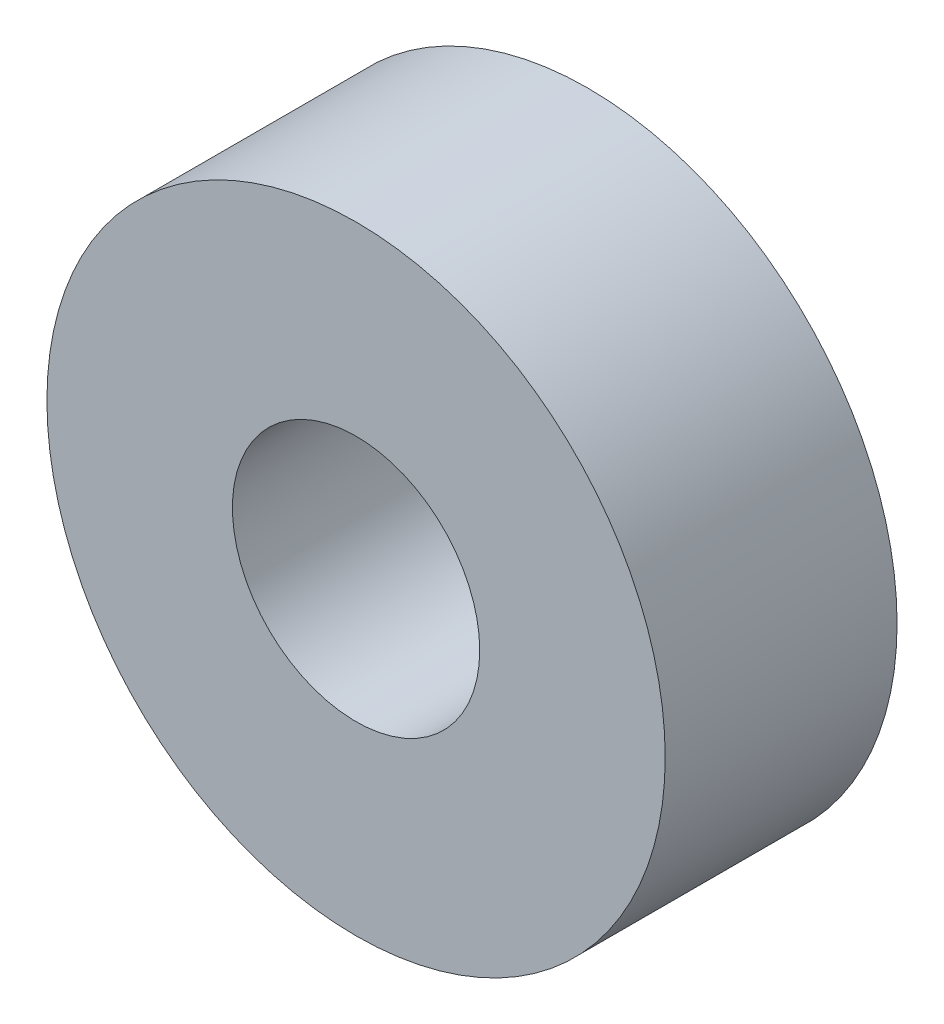
ISO-10303-21;
HEADER;
FILE_DESCRIPTION(('STEP AP214'),'2;1');
FILE_NAME('part.step','',(''),(''),'','','');
FILE_SCHEMA(('AUTOMOTIVE_DESIGN { 1 0 10303 214 1 1 1 1 }'));
ENDSEC;
DATA;
#1=APPLICATION_CONTEXT('core data for automotive mechanical design processes');
#2=APPLICATION_PROTOCOL_DEFINITION('international standard','automotive_design',2000,#1);
#3=PRODUCT_CONTEXT('',#1,'mechanical');
#4=PRODUCT('Part','Part','',(#3));
#5=PRODUCT_RELATED_PRODUCT_CATEGORY('part','',(#4));
#6=PRODUCT_DEFINITION_FORMATION('','',#4);
#7=PRODUCT_DEFINITION_CONTEXT('part definition',#1,'design');
#8=PRODUCT_DEFINITION('design','',#6,#7);
#9=PRODUCT_DEFINITION_SHAPE('','',#8);
#10=(LENGTH_UNIT() NAMED_UNIT(*) SI_UNIT(.MILLI.,.METRE.));
#11=(NAMED_UNIT(*) PLANE_ANGLE_UNIT() SI_UNIT($,.RADIAN.));
#12=(NAMED_UNIT(*) SI_UNIT($,.STERADIAN.) SOLID_ANGLE_UNIT());
#13=UNCERTAINTY_MEASURE_WITH_UNIT(LENGTH_MEASURE(1.E-05),#10,'distance_accuracy_value','');
#14=(GEOMETRIC_REPRESENTATION_CONTEXT(3) GLOBAL_UNCERTAINTY_ASSIGNED_CONTEXT((#13)) GLOBAL_UNIT_ASSIGNED_CONTEXT((#10,
#11,#12)) REPRESENTATION_CONTEXT('',''));
#15=CARTESIAN_POINT('',(0.,0.,0.));
#16=DIRECTION('',(0.,0.,1.));
#17=DIRECTION('',(1.,0.,0.));
#18=AXIS2_PLACEMENT_3D('',#15,#16,#17);
#19=CARTESIAN_POINT('',(0.,0.,1.5));
#20=DIRECTION('',(0.,0.,1.));
#21=DIRECTION('',(1.,0.,0.));
#22=AXIS2_PLACEMENT_3D('',#19,#20,#21);
#23=PLANE('',#22);
#24=CARTESIAN_POINT('',(0.,0.,1.5));
#25=DIRECTION('',(0.,0.,1.));
#26=DIRECTION('',(1.,0.,0.));
#27=AXIS2_PLACEMENT_3D('',#24,#25,#26);
#28=CIRCLE('',#27,4.);
#29=CARTESIAN_POINT('',(4.,0.,1.5));
#30=VERTEX_POINT('',#29);
#31=EDGE_CURVE('E10',#30,#30,#28,.T.);
#32=ORIENTED_EDGE('',*,*,#31,.T.);
#33=EDGE_LOOP('',(#32));
#34=FACE_BOUND('',#33,.T.);
#35=CARTESIAN_POINT('',(0.,0.,1.5));
#36=DIRECTION('',(0.,0.,1.));
#37=DIRECTION('',(1.,0.,0.));
#38=AXIS2_PLACEMENT_3D('',#35,#36,#37);
#39=CIRCLE('',#38,1.6);
#40=CARTESIAN_POINT('',(1.6,0.,1.5));
#41=VERTEX_POINT('',#40);
#42=EDGE_CURVE('E45',#41,#41,#39,.T.);
#43=ORIENTED_EDGE('',*,*,#42,.F.);
#44=EDGE_LOOP('',(#43));
#45=FACE_BOUND('',#44,.T.);
#46=ADVANCED_FACE('F34',(#34,#45),#23,.T.);
#47=CARTESIAN_POINT('',(0.,0.,-1.5));
#48=DIRECTION('',(0.,0.,1.));
#49=DIRECTION('',(1.,0.,0.));
#50=AXIS2_PLACEMENT_3D('',#47,#48,#49);
#51=PLANE('',#50);
#52=CARTESIAN_POINT('',(0.,0.,-1.5));
#53=DIRECTION('',(0.,0.,1.));
#54=DIRECTION('',(1.,0.,0.));
#55=AXIS2_PLACEMENT_3D('',#52,#53,#54);
#56=CIRCLE('',#55,4.);
#57=CARTESIAN_POINT('',(4.,0.,-1.5));
#58=VERTEX_POINT('',#57);
#59=EDGE_CURVE('E38',#58,#58,#56,.T.);
#60=ORIENTED_EDGE('',*,*,#59,.F.);
#61=EDGE_LOOP('',(#60));
#62=FACE_BOUND('',#61,.T.);
#63=CARTESIAN_POINT('',(0.,0.,-1.5));
#64=DIRECTION('',(0.,0.,1.));
#65=DIRECTION('',(1.,0.,0.));
#66=AXIS2_PLACEMENT_3D('',#63,#64,#65);
#67=CIRCLE('',#66,1.6);
#68=CARTESIAN_POINT('',(1.6,0.,-1.5));
#69=VERTEX_POINT('',#68);
#70=EDGE_CURVE('E47',#69,#69,#67,.T.);
#71=ORIENTED_EDGE('',*,*,#70,.T.);
#72=EDGE_LOOP('',(#71));
#73=FACE_BOUND('',#72,.T.);
#74=ADVANCED_FACE('F57',(#62,#73),#51,.F.);
#75=CARTESIAN_POINT('',(0.,0.,1.5));
#76=DIRECTION('',(0.,0.,-1.));
#77=DIRECTION('',(-1.,0.,0.));
#78=AXIS2_PLACEMENT_3D('',#75,#76,#77);
#79=CYLINDRICAL_SURFACE('',#78,4.);
#80=ORIENTED_EDGE('',*,*,#31,.F.);
#81=EDGE_LOOP('',(#80));
#82=FACE_BOUND('',#81,.T.);
#83=ORIENTED_EDGE('',*,*,#59,.T.);
#84=EDGE_LOOP('',(#83));
#85=FACE_BOUND('',#84,.T.);
#86=ADVANCED_FACE('F36',(#82,#85),#79,.T.);
#87=CARTESIAN_POINT('',(0.,0.,1.5));
#88=DIRECTION('',(0.,0.,-1.));
#89=DIRECTION('',(-1.,0.,0.));
#90=AXIS2_PLACEMENT_3D('',#87,#88,#89);
#91=CYLINDRICAL_SURFACE('',#90,1.6);
#92=ORIENTED_EDGE('',*,*,#42,.T.);
#93=EDGE_LOOP('',(#92));
#94=FACE_BOUND('',#93,.T.);
#95=ORIENTED_EDGE('',*,*,#70,.F.);
#96=EDGE_LOOP('',(#95));
#97=FACE_BOUND('',#96,.T.);
#98=ADVANCED_FACE('F53',(#94,#97),#91,.F.);
#99=CLOSED_SHELL('',(#46,#74,#86,#98));
#100=MANIFOLD_SOLID_BREP('B2',#99);
#101=ADVANCED_BREP_SHAPE_REPRESENTATION('',(#18,#100),#14);
#102=SHAPE_DEFINITION_REPRESENTATION(#9,#101);
ENDSEC;
END-ISO-10303-21;
